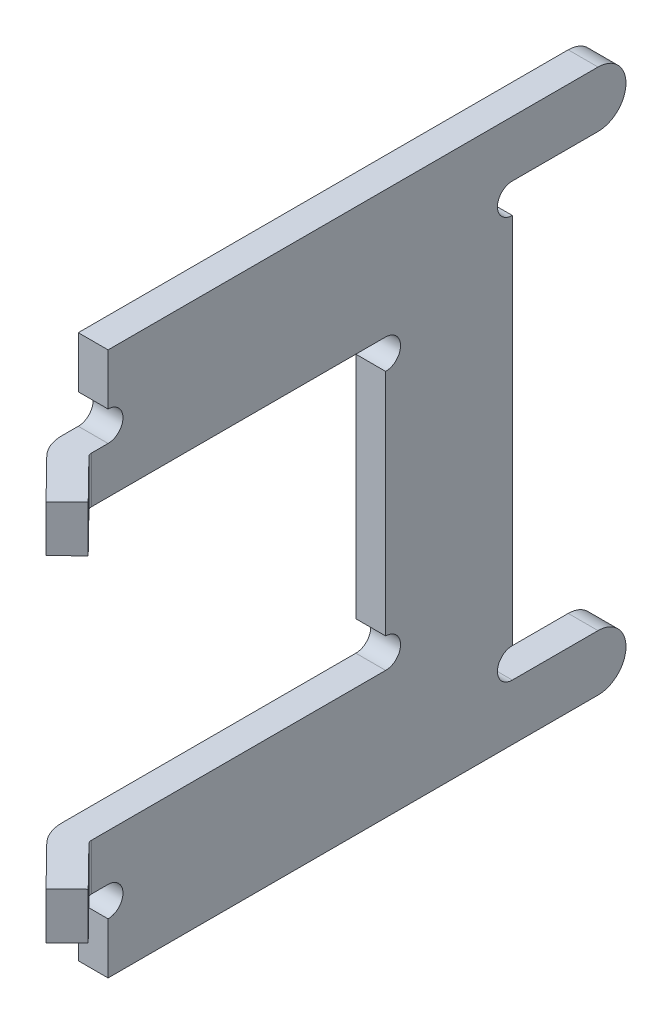
ISO-10303-21;
HEADER;
FILE_DESCRIPTION(('STEP AP214'),'2;1');
FILE_NAME('part.step','',(''),(''),'','','');
FILE_SCHEMA(('AUTOMOTIVE_DESIGN { 1 0 10303 214 1 1 1 1 }'));
ENDSEC;
DATA;
#1=APPLICATION_CONTEXT('core data for automotive mechanical design processes');
#2=APPLICATION_PROTOCOL_DEFINITION('international standard','automotive_design',2000,#1);
#3=PRODUCT_CONTEXT('',#1,'mechanical');
#4=PRODUCT('Part','Part','',(#3));
#5=PRODUCT_RELATED_PRODUCT_CATEGORY('part','',(#4));
#6=PRODUCT_DEFINITION_FORMATION('','',#4);
#7=PRODUCT_DEFINITION_CONTEXT('part definition',#1,'design');
#8=PRODUCT_DEFINITION('design','',#6,#7);
#9=PRODUCT_DEFINITION_SHAPE('','',#8);
#10=(LENGTH_UNIT() NAMED_UNIT(*) SI_UNIT(.MILLI.,.METRE.));
#11=(NAMED_UNIT(*) PLANE_ANGLE_UNIT() SI_UNIT($,.RADIAN.));
#12=(NAMED_UNIT(*) SI_UNIT($,.STERADIAN.) SOLID_ANGLE_UNIT());
#13=UNCERTAINTY_MEASURE_WITH_UNIT(LENGTH_MEASURE(1.E-05),#10,'distance_accuracy_value','');
#14=(GEOMETRIC_REPRESENTATION_CONTEXT(3) GLOBAL_UNCERTAINTY_ASSIGNED_CONTEXT((#13)) GLOBAL_UNIT_ASSIGNED_CONTEXT((#10,
#11,#12)) REPRESENTATION_CONTEXT('',''));
#15=CARTESIAN_POINT('',(0.,0.,0.));
#16=DIRECTION('',(0.,0.,1.));
#17=DIRECTION('',(1.,0.,0.));
#18=AXIS2_PLACEMENT_3D('',#15,#16,#17);
#19=CARTESIAN_POINT('',(0.,5.125,7.125));
#20=DIRECTION('',(0.,1.,0.));
#21=DIRECTION('',(0.,0.,1.));
#22=AXIS2_PLACEMENT_3D('',#19,#20,#21);
#23=PLANE('',#22);
#24=CARTESIAN_POINT('',(0.555393539521985,5.125,11.3));
#25=DIRECTION('',(0.,1.,0.));
#26=DIRECTION('',(0.,0.,1.));
#27=AXIS2_PLACEMENT_3D('',#24,#25,#26);
#28=CIRCLE('',#27,0.155393539521985);
#29=CARTESIAN_POINT('',(0.444517707938763,5.125,11.4088747082471));
#30=VERTEX_POINT('',#29);
#31=CARTESIAN_POINT('',(0.4,5.125,11.3));
#32=VERTEX_POINT('',#31);
#33=EDGE_CURVE('E20',#30,#32,#28,.F.);
#34=ORIENTED_EDGE('',*,*,#33,.T.);
#35=DIRECTION('',(0.,0.,1.));
#36=VECTOR('',#35,1.);
#37=CARTESIAN_POINT('',(0.4,5.125,7.125));
#38=LINE('',#37,#36);
#39=CARTESIAN_POINT('',(0.399999999999999,5.125,10.85));
#40=VERTEX_POINT('',#39);
#41=EDGE_CURVE('E200',#32,#40,#38,.F.);
#42=ORIENTED_EDGE('',*,*,#41,.T.);
#43=DIRECTION('',(-1.,0.,0.));
#44=VECTOR('',#43,1.);
#45=CARTESIAN_POINT('',(0.4,5.125,10.85));
#46=LINE('',#45,#44);
#47=CARTESIAN_POINT('',(-0.400000000000001,5.125,10.85));
#48=VERTEX_POINT('',#47);
#49=EDGE_CURVE('E230',#40,#48,#46,.T.);
#50=ORIENTED_EDGE('',*,*,#49,.T.);
#51=DIRECTION('',(0.,0.,1.));
#52=VECTOR('',#51,1.);
#53=CARTESIAN_POINT('',(-0.399999999999999,5.125,0.));
#54=LINE('',#53,#52);
#55=CARTESIAN_POINT('',(-0.399999999999999,5.125,11.3));
#56=VERTEX_POINT('',#55);
#57=EDGE_CURVE('E261',#56,#48,#54,.F.);
#58=ORIENTED_EDGE('',*,*,#57,.F.);
#59=CARTESIAN_POINT('',(0.555393539521985,5.125,11.3));
#60=DIRECTION('',(0.,1.,0.));
#61=DIRECTION('',(0.,0.,1.));
#62=AXIS2_PLACEMENT_3D('',#59,#60,#61);
#63=CIRCLE('',#62,0.955393539521986);
#64=CARTESIAN_POINT('',(-0.126295374377499,5.125,11.969385569031));
#65=VERTEX_POINT('',#64);
#66=EDGE_CURVE('E268',#65,#56,#63,.F.);
#67=ORIENTED_EDGE('',*,*,#66,.F.);
#68=DIRECTION('',(0.700638575979764,0.,0.713516352895326));
#69=VECTOR('',#68,1.);
#70=CARTESIAN_POINT('',(0.924662489592148,5.125,13.0396600983739));
#71=LINE('',#70,#69);
#72=CARTESIAN_POINT('',(0.924662489592147,5.125,13.0396600983739));
#73=VERTEX_POINT('',#72);
#74=EDGE_CURVE('E257',#73,#65,#71,.F.);
#75=ORIENTED_EDGE('',*,*,#74,.F.);
#76=DIRECTION('',(0.713516352895326,0.,-0.700638575979765));
#77=VECTOR('',#76,1.);
#78=CARTESIAN_POINT('',(1.49547557190841,5.125,12.4791492375901));
#79=LINE('',#78,#77);
#80=CARTESIAN_POINT('',(1.49547557190841,5.125,12.4791492375901));
#81=VERTEX_POINT('',#80);
#82=EDGE_CURVE('E206',#81,#73,#79,.F.);
#83=ORIENTED_EDGE('',*,*,#82,.F.);
#84=DIRECTION('',(-0.700638575979764,0.,-0.713516352895326));
#85=VECTOR('',#84,1.);
#86=CARTESIAN_POINT('',(0.444517707938763,5.125,11.4088747082471));
#87=LINE('',#86,#85);
#88=EDGE_CURVE('E203',#30,#81,#87,.F.);
#89=ORIENTED_EDGE('',*,*,#88,.F.);
#90=EDGE_LOOP('',(#34,#42,#50,#58,#67,#75,#83,#89));
#91=FACE_BOUND('',#90,.T.);
#92=ADVANCED_FACE('F17',(#91),#23,.T.);
#93=CARTESIAN_POINT('',(0.555393539521985,3.875,11.3));
#94=DIRECTION('',(0.,1.,0.));
#95=DIRECTION('',(0.,0.,1.));
#96=AXIS2_PLACEMENT_3D('',#93,#94,#95);
#97=CYLINDRICAL_SURFACE('',#96,0.955393539521986);
#98=CARTESIAN_POINT('',(0.555393539521985,3.875,11.3));
#99=DIRECTION('',(0.,1.,0.));
#100=DIRECTION('',(0.,0.,1.));
#101=AXIS2_PLACEMENT_3D('',#98,#99,#100);
#102=CIRCLE('',#101,0.955393539521986);
#103=CARTESIAN_POINT('',(-0.400000000000001,3.875,11.3));
#104=VERTEX_POINT('',#103);
#105=CARTESIAN_POINT('',(-0.126295374377499,3.875,11.969385569031));
#106=VERTEX_POINT('',#105);
#107=EDGE_CURVE('E226',#104,#106,#102,.T.);
#108=ORIENTED_EDGE('',*,*,#107,.T.);
#109=DIRECTION('',(0.,1.,0.));
#110=VECTOR('',#109,1.);
#111=CARTESIAN_POINT('',(-0.1262953743775,3.875,11.969385569031));
#112=LINE('',#111,#110);
#113=EDGE_CURVE('E253',#65,#106,#112,.F.);
#114=ORIENTED_EDGE('',*,*,#113,.F.);
#115=ORIENTED_EDGE('',*,*,#66,.T.);
#116=DIRECTION('',(0.,1.,0.));
#117=VECTOR('',#116,1.);
#118=CARTESIAN_POINT('',(-0.399999999999999,-7.3,11.3));
#119=LINE('',#118,#117);
#120=EDGE_CURVE('E258',#104,#56,#119,.T.);
#121=ORIENTED_EDGE('',*,*,#120,.F.);
#122=EDGE_LOOP('',(#108,#114,#115,#121));
#123=FACE_BOUND('',#122,.T.);
#124=ADVANCED_FACE('F406',(#123),#97,.T.);
#125=CARTESIAN_POINT('',(0.924662489592148,3.875,13.0396600983739));
#126=DIRECTION('',(-0.713516352895326,0.,0.700638575979764));
#127=DIRECTION('',(0.700638575979764,0.,0.713516352895326));
#128=AXIS2_PLACEMENT_3D('',#125,#126,#127);
#129=PLANE('',#128);
#130=DIRECTION('',(0.700638575979764,0.,0.713516352895326));
#131=VECTOR('',#130,1.);
#132=CARTESIAN_POINT('',(-0.1262953743775,3.875,11.969385569031));
#133=LINE('',#132,#131);
#134=CARTESIAN_POINT('',(0.924662489592148,3.875,13.0396600983739));
#135=VERTEX_POINT('',#134);
#136=EDGE_CURVE('E245',#106,#135,#133,.T.);
#137=ORIENTED_EDGE('',*,*,#136,.T.);
#138=DIRECTION('',(0.,1.,0.));
#139=VECTOR('',#138,1.);
#140=CARTESIAN_POINT('',(0.924662489592147,3.875,13.0396600983739));
#141=LINE('',#140,#139);
#142=EDGE_CURVE('E212',#73,#135,#141,.F.);
#143=ORIENTED_EDGE('',*,*,#142,.F.);
#144=ORIENTED_EDGE('',*,*,#74,.T.);
#145=ORIENTED_EDGE('',*,*,#113,.T.);
#146=EDGE_LOOP('',(#137,#143,#144,#145));
#147=FACE_BOUND('',#146,.T.);
#148=ADVANCED_FACE('F425',(#147),#129,.T.);
#149=CARTESIAN_POINT('',(1.49547557190841,3.875,12.4791492375901));
#150=DIRECTION('',(0.700638575979765,0.,0.713516352895326));
#151=DIRECTION('',(0.713516352895326,0.,-0.700638575979765));
#152=AXIS2_PLACEMENT_3D('',#149,#150,#151);
#153=PLANE('',#152);
#154=DIRECTION('',(0.713516352895325,0.,-0.700638575979766));
#155=VECTOR('',#154,1.);
#156=CARTESIAN_POINT('',(0.924662489592148,3.875,13.0396600983739));
#157=LINE('',#156,#155);
#158=CARTESIAN_POINT('',(1.49547557190841,3.875,12.4791492375901));
#159=VERTEX_POINT('',#158);
#160=EDGE_CURVE('E241',#135,#159,#157,.T.);
#161=ORIENTED_EDGE('',*,*,#160,.T.);
#162=DIRECTION('',(0.,1.,0.));
#163=VECTOR('',#162,1.);
#164=CARTESIAN_POINT('',(1.49547557190841,3.875,12.4791492375901));
#165=LINE('',#164,#163);
#166=EDGE_CURVE('E211',#81,#159,#165,.F.);
#167=ORIENTED_EDGE('',*,*,#166,.F.);
#168=ORIENTED_EDGE('',*,*,#82,.T.);
#169=ORIENTED_EDGE('',*,*,#142,.T.);
#170=EDGE_LOOP('',(#161,#167,#168,#169));
#171=FACE_BOUND('',#170,.T.);
#172=ADVANCED_FACE('F940',(#171),#153,.T.);
#173=CARTESIAN_POINT('',(0.444517707938763,3.875,11.4088747082471));
#174=DIRECTION('',(0.713516352895326,0.,-0.700638575979764));
#175=DIRECTION('',(-0.700638575979764,0.,-0.713516352895326));
#176=AXIS2_PLACEMENT_3D('',#173,#174,#175);
#177=PLANE('',#176);
#178=DIRECTION('',(-0.700638575979764,0.,-0.713516352895326));
#179=VECTOR('',#178,1.);
#180=CARTESIAN_POINT('',(1.49547557190841,3.875,12.4791492375901));
#181=LINE('',#180,#179);
#182=CARTESIAN_POINT('',(0.444517707938763,3.875,11.4088747082471));
#183=VERTEX_POINT('',#182);
#184=EDGE_CURVE('E216',#159,#183,#181,.T.);
#185=ORIENTED_EDGE('',*,*,#184,.T.);
#186=DIRECTION('',(0.,1.,0.));
#187=VECTOR('',#186,1.);
#188=CARTESIAN_POINT('',(0.444517707938762,3.875,11.4088747082471));
#189=LINE('',#188,#187);
#190=EDGE_CURVE('E194',#183,#30,#189,.T.);
#191=ORIENTED_EDGE('',*,*,#190,.T.);
#192=ORIENTED_EDGE('',*,*,#88,.T.);
#193=ORIENTED_EDGE('',*,*,#166,.T.);
#194=EDGE_LOOP('',(#185,#191,#192,#193));
#195=FACE_BOUND('',#194,.T.);
#196=ADVANCED_FACE('F214',(#195),#177,.T.);
#197=CARTESIAN_POINT('',(1.49547557190841,-3.875,12.4791492375901));
#198=DIRECTION('',(-0.700638575979765,0.,-0.713516352895326));
#199=DIRECTION('',(-0.713516352895326,0.,0.700638575979765));
#200=AXIS2_PLACEMENT_3D('',#197,#198,#199);
#201=PLANE('',#200);
#202=DIRECTION('',(0.,1.,0.));
#203=VECTOR('',#202,1.);
#204=CARTESIAN_POINT('',(1.49547557190841,-3.875,12.4791492375901));
#205=LINE('',#204,#203);
#206=CARTESIAN_POINT('',(1.49547557190841,-5.125,12.4791492375901));
#207=VERTEX_POINT('',#206);
#208=CARTESIAN_POINT('',(1.49547557190841,-3.875,12.4791492375901));
#209=VERTEX_POINT('',#208);
#210=EDGE_CURVE('E399',#207,#209,#205,.T.);
#211=ORIENTED_EDGE('',*,*,#210,.T.);
#212=DIRECTION('',(-0.713516352895325,0.,0.700638575979766));
#213=VECTOR('',#212,1.);
#214=CARTESIAN_POINT('',(1.49547557190841,-3.875,12.4791492375901));
#215=LINE('',#214,#213);
#216=CARTESIAN_POINT('',(0.924662489592148,-3.875,13.0396600983739));
#217=VERTEX_POINT('',#216);
#218=EDGE_CURVE('E519',#209,#217,#215,.T.);
#219=ORIENTED_EDGE('',*,*,#218,.T.);
#220=DIRECTION('',(0.,1.,0.));
#221=VECTOR('',#220,1.);
#222=CARTESIAN_POINT('',(0.924662489592148,-3.875,13.0396600983739));
#223=LINE('',#222,#221);
#224=CARTESIAN_POINT('',(0.924662489592148,-5.125,13.0396600983739));
#225=VERTEX_POINT('',#224);
#226=EDGE_CURVE('E238',#217,#225,#223,.F.);
#227=ORIENTED_EDGE('',*,*,#226,.T.);
#228=DIRECTION('',(0.713516352895325,0.,-0.700638575979766));
#229=VECTOR('',#228,1.);
#230=CARTESIAN_POINT('',(0.924662489592148,-5.125,13.0396600983739));
#231=LINE('',#230,#229);
#232=EDGE_CURVE('E288',#225,#207,#231,.T.);
#233=ORIENTED_EDGE('',*,*,#232,.T.);
#234=EDGE_LOOP('',(#211,#219,#227,#233));
#235=FACE_BOUND('',#234,.T.);
#236=ADVANCED_FACE('F616',(#235),#201,.F.);
#237=CARTESIAN_POINT('',(0.924662489592148,-3.875,13.0396600983739));
#238=DIRECTION('',(0.713516352895326,0.,-0.700638575979764));
#239=DIRECTION('',(-0.700638575979764,0.,-0.713516352895326));
#240=AXIS2_PLACEMENT_3D('',#237,#238,#239);
#241=PLANE('',#240);
#242=ORIENTED_EDGE('',*,*,#226,.F.);
#243=DIRECTION('',(-0.700638575979764,0.,-0.713516352895326));
#244=VECTOR('',#243,1.);
#245=CARTESIAN_POINT('',(0.924662489592148,-3.875,13.0396600983739));
#246=LINE('',#245,#244);
#247=CARTESIAN_POINT('',(-0.1262953743775,-3.875,11.969385569031));
#248=VERTEX_POINT('',#247);
#249=EDGE_CURVE('E375',#217,#248,#246,.T.);
#250=ORIENTED_EDGE('',*,*,#249,.T.);
#251=DIRECTION('',(0.,1.,0.));
#252=VECTOR('',#251,1.);
#253=CARTESIAN_POINT('',(-0.126295374377501,-3.875,11.969385569031));
#254=LINE('',#253,#252);
#255=CARTESIAN_POINT('',(-0.1262953743775,-5.125,11.969385569031));
#256=VERTEX_POINT('',#255);
#257=EDGE_CURVE('E600',#256,#248,#254,.T.);
#258=ORIENTED_EDGE('',*,*,#257,.F.);
#259=DIRECTION('',(0.700638575979764,0.,0.713516352895326));
#260=VECTOR('',#259,1.);
#261=CARTESIAN_POINT('',(-0.1262953743775,-5.125,11.969385569031));
#262=LINE('',#261,#260);
#263=EDGE_CURVE('E293',#256,#225,#262,.T.);
#264=ORIENTED_EDGE('',*,*,#263,.T.);
#265=EDGE_LOOP('',(#242,#250,#258,#264));
#266=FACE_BOUND('',#265,.T.);
#267=ADVANCED_FACE('F633',(#266),#241,.F.);
#268=CARTESIAN_POINT('',(0.555393539521985,-3.875,11.3));
#269=DIRECTION('',(0.,1.,0.));
#270=DIRECTION('',(0.,0.,1.));
#271=AXIS2_PLACEMENT_3D('',#268,#269,#270);
#272=CYLINDRICAL_SURFACE('',#271,0.955393539521986);
#273=CARTESIAN_POINT('',(0.555393539521985,-3.875,11.3));
#274=DIRECTION('',(0.,1.,0.));
#275=DIRECTION('',(0.,0.,1.));
#276=AXIS2_PLACEMENT_3D('',#273,#274,#275);
#277=CIRCLE('',#276,0.955393539521986);
#278=CARTESIAN_POINT('',(-0.4,-3.875,11.3));
#279=VERTEX_POINT('',#278);
#280=EDGE_CURVE('E371',#248,#279,#277,.F.);
#281=ORIENTED_EDGE('',*,*,#280,.T.);
#282=DIRECTION('',(0.,1.,0.));
#283=VECTOR('',#282,1.);
#284=CARTESIAN_POINT('',(-0.399999999999999,-7.3,11.3));
#285=LINE('',#284,#283);
#286=CARTESIAN_POINT('',(-0.399999999999999,-5.125,11.3));
#287=VERTEX_POINT('',#286);
#288=EDGE_CURVE('E262',#287,#279,#285,.T.);
#289=ORIENTED_EDGE('',*,*,#288,.F.);
#290=CARTESIAN_POINT('',(0.555393539521985,-5.125,11.3));
#291=DIRECTION('',(0.,1.,0.));
#292=DIRECTION('',(0.,0.,1.));
#293=AXIS2_PLACEMENT_3D('',#290,#291,#292);
#294=CIRCLE('',#293,0.955393539521986);
#295=EDGE_CURVE('E396',#287,#256,#294,.T.);
#296=ORIENTED_EDGE('',*,*,#295,.T.);
#297=ORIENTED_EDGE('',*,*,#257,.T.);
#298=EDGE_LOOP('',(#281,#289,#296,#297));
#299=FACE_BOUND('',#298,.T.);
#300=ADVANCED_FACE('F635',(#299),#272,.T.);
#301=CARTESIAN_POINT('',(0.444517707938763,-3.875,11.4088747082471));
#302=DIRECTION('',(-0.713516352895326,0.,0.700638575979764));
#303=DIRECTION('',(0.700638575979764,0.,0.713516352895326));
#304=AXIS2_PLACEMENT_3D('',#301,#302,#303);
#305=PLANE('',#304);
#306=DIRECTION('',(0.,1.,0.));
#307=VECTOR('',#306,1.);
#308=CARTESIAN_POINT('',(0.444517707938762,-3.875,11.4088747082471));
#309=LINE('',#308,#307);
#310=CARTESIAN_POINT('',(0.444517707938763,-5.125,11.4088747082471));
#311=VERTEX_POINT('',#310);
#312=CARTESIAN_POINT('',(0.444517707938763,-3.875,11.4088747082471));
#313=VERTEX_POINT('',#312);
#314=EDGE_CURVE('E370',#311,#313,#309,.T.);
#315=ORIENTED_EDGE('',*,*,#314,.T.);
#316=DIRECTION('',(0.700638575979764,0.,0.713516352895326));
#317=VECTOR('',#316,1.);
#318=CARTESIAN_POINT('',(0.444517707938763,-3.875,11.4088747082471));
#319=LINE('',#318,#317);
#320=EDGE_CURVE('E522',#313,#209,#319,.T.);
#321=ORIENTED_EDGE('',*,*,#320,.T.);
#322=ORIENTED_EDGE('',*,*,#210,.F.);
#323=DIRECTION('',(-0.700638575979764,0.,-0.713516352895326));
#324=VECTOR('',#323,1.);
#325=CARTESIAN_POINT('',(1.49547557190841,-5.125,12.4791492375901));
#326=LINE('',#325,#324);
#327=EDGE_CURVE('E292',#207,#311,#326,.T.);
#328=ORIENTED_EDGE('',*,*,#327,.T.);
#329=EDGE_LOOP('',(#315,#321,#322,#328));
#330=FACE_BOUND('',#329,.T.);
#331=ADVANCED_FACE('F623',(#330),#305,.F.);
#332=CARTESIAN_POINT('',(0.,-5.125,7.125));
#333=DIRECTION('',(0.,1.,0.));
#334=DIRECTION('',(0.,0.,1.));
#335=AXIS2_PLACEMENT_3D('',#332,#333,#334);
#336=PLANE('',#335);
#337=DIRECTION('',(0.,0.,1.));
#338=VECTOR('',#337,1.);
#339=CARTESIAN_POINT('',(0.4,-5.125,7.125));
#340=LINE('',#339,#338);
#341=CARTESIAN_POINT('',(0.4,-5.125,11.3));
#342=VERTEX_POINT('',#341);
#343=CARTESIAN_POINT('',(0.399999999999999,-5.125,10.85));
#344=VERTEX_POINT('',#343);
#345=EDGE_CURVE('E572',#342,#344,#340,.F.);
#346=ORIENTED_EDGE('',*,*,#345,.F.);
#347=CARTESIAN_POINT('',(0.555393539521985,-5.125,11.3));
#348=DIRECTION('',(0.,1.,0.));
#349=DIRECTION('',(0.,0.,1.));
#350=AXIS2_PLACEMENT_3D('',#347,#348,#349);
#351=CIRCLE('',#350,0.155393539521985);
#352=EDGE_CURVE('E363',#342,#311,#351,.T.);
#353=ORIENTED_EDGE('',*,*,#352,.T.);
#354=ORIENTED_EDGE('',*,*,#327,.F.);
#355=ORIENTED_EDGE('',*,*,#232,.F.);
#356=ORIENTED_EDGE('',*,*,#263,.F.);
#357=ORIENTED_EDGE('',*,*,#295,.F.);
#358=DIRECTION('',(0.,0.,1.));
#359=VECTOR('',#358,1.);
#360=CARTESIAN_POINT('',(-0.399999999999999,-5.125,0.));
#361=LINE('',#360,#359);
#362=CARTESIAN_POINT('',(-0.399999999999999,-5.125,10.85));
#363=VERTEX_POINT('',#362);
#364=EDGE_CURVE('E568',#363,#287,#361,.T.);
#365=ORIENTED_EDGE('',*,*,#364,.F.);
#366=DIRECTION('',(-1.,0.,0.));
#367=VECTOR('',#366,1.);
#368=CARTESIAN_POINT('',(0.400000000000001,-5.125,10.85));
#369=LINE('',#368,#367);
#370=EDGE_CURVE('E362',#363,#344,#369,.F.);
#371=ORIENTED_EDGE('',*,*,#370,.T.);
#372=EDGE_LOOP('',(#346,#353,#354,#355,#356,#357,#365,#371));
#373=FACE_BOUND('',#372,.T.);
#374=ADVANCED_FACE('F639',(#373),#336,.F.);
#375=CARTESIAN_POINT('',(-0.399999999999999,-7.3,0.));
#376=DIRECTION('',(-1.,0.,0.));
#377=DIRECTION('',(0.,0.,1.));
#378=AXIS2_PLACEMENT_3D('',#375,#376,#377);
#379=PLANE('',#378);
#380=CARTESIAN_POINT('',(-0.400000000000004,6.54999999999999,-2.29999999999991));
#381=DIRECTION('',(1.,0.,0.));
#382=DIRECTION('',(0.,0.,-1.));
#383=AXIS2_PLACEMENT_3D('',#380,#381,#382);
#384=CIRCLE('',#383,0.750000000000002);
#385=CARTESIAN_POINT('',(-0.400000000000004,5.79999999999999,-2.29999999999991));
#386=VERTEX_POINT('',#385);
#387=CARTESIAN_POINT('',(-0.400000000000004,7.3,-2.29999999999991));
#388=VERTEX_POINT('',#387);
#389=EDGE_CURVE('E390',#386,#388,#384,.T.);
#390=ORIENTED_EDGE('',*,*,#389,.F.);
#391=DIRECTION('',(0.,0.,-1.));
#392=VECTOR('',#391,1.);
#393=CARTESIAN_POINT('',(-0.400000000000004,5.79999999999999,-2.29999999999991));
#394=LINE('',#393,#392);
#395=CARTESIAN_POINT('',(-0.400000000000004,5.79999999999999,0.));
#396=VERTEX_POINT('',#395);
#397=EDGE_CURVE('E283',#396,#386,#394,.T.);
#398=ORIENTED_EDGE('',*,*,#397,.F.);
#399=CARTESIAN_POINT('',(-0.400000000000004,5.4,0.));
#400=DIRECTION('',(1.,0.,0.));
#401=DIRECTION('',(0.,0.,-1.));
#402=AXIS2_PLACEMENT_3D('',#399,#400,#401);
#403=CIRCLE('',#402,0.4);
#404=CARTESIAN_POINT('',(-0.400000000000004,5.,0.));
#405=VERTEX_POINT('',#404);
#406=EDGE_CURVE('E393',#396,#405,#403,.T.);
#407=ORIENTED_EDGE('',*,*,#406,.T.);
#408=DIRECTION('',(0.,1.,0.));
#409=VECTOR('',#408,1.);
#410=CARTESIAN_POINT('',(-0.400000000000003,0.,0.));
#411=LINE('',#410,#409);
#412=CARTESIAN_POINT('',(-0.400000000000002,-5.,0.));
#413=VERTEX_POINT('',#412);
#414=EDGE_CURVE('E497',#405,#413,#411,.F.);
#415=ORIENTED_EDGE('',*,*,#414,.T.);
#416=CARTESIAN_POINT('',(-0.4,-5.4,0.));
#417=DIRECTION('',(1.,0.,0.));
#418=DIRECTION('',(0.,0.,-1.));
#419=AXIS2_PLACEMENT_3D('',#416,#417,#418);
#420=CIRCLE('',#419,0.4);
#421=CARTESIAN_POINT('',(-0.4,-5.8,0.));
#422=VERTEX_POINT('',#421);
#423=EDGE_CURVE('E347',#413,#422,#420,.T.);
#424=ORIENTED_EDGE('',*,*,#423,.T.);
#425=DIRECTION('',(0.,0.,1.));
#426=VECTOR('',#425,1.);
#427=CARTESIAN_POINT('',(-0.4,-5.8,0.));
#428=LINE('',#427,#426);
#429=CARTESIAN_POINT('',(-0.4,-5.8,-2.3));
#430=VERTEX_POINT('',#429);
#431=EDGE_CURVE('E351',#430,#422,#428,.T.);
#432=ORIENTED_EDGE('',*,*,#431,.F.);
#433=CARTESIAN_POINT('',(-0.399999999999999,-6.55,-2.3));
#434=DIRECTION('',(1.,0.,0.));
#435=DIRECTION('',(0.,0.,-1.));
#436=AXIS2_PLACEMENT_3D('',#433,#434,#435);
#437=CIRCLE('',#436,0.75);
#438=CARTESIAN_POINT('',(-0.399999999999999,-7.3,-2.3));
#439=VERTEX_POINT('',#438);
#440=EDGE_CURVE('E352',#439,#430,#437,.T.);
#441=ORIENTED_EDGE('',*,*,#440,.F.);
#442=DIRECTION('',(0.,0.,-1.));
#443=VECTOR('',#442,1.);
#444=CARTESIAN_POINT('',(-0.399999999999999,-7.3,0.));
#445=LINE('',#444,#443);
#446=CARTESIAN_POINT('',(-0.399999999999999,-7.3,10.85));
#447=VERTEX_POINT('',#446);
#448=EDGE_CURVE('E457',#447,#439,#445,.T.);
#449=ORIENTED_EDGE('',*,*,#448,.F.);
#450=DIRECTION('',(0.,1.,0.));
#451=VECTOR('',#450,1.);
#452=CARTESIAN_POINT('',(-0.399999999999999,0.,10.85));
#453=LINE('',#452,#451);
#454=CARTESIAN_POINT('',(-0.399999999999999,-5.925,10.85));
#455=VERTEX_POINT('',#454);
#456=EDGE_CURVE('E454',#455,#447,#453,.F.);
#457=ORIENTED_EDGE('',*,*,#456,.F.);
#458=CARTESIAN_POINT('',(-0.399999999999999,-5.525,10.85));
#459=DIRECTION('',(-1.,0.,0.));
#460=DIRECTION('',(0.,0.,1.));
#461=AXIS2_PLACEMENT_3D('',#458,#459,#460);
#462=CIRCLE('',#461,0.4);
#463=EDGE_CURVE('E357',#455,#363,#462,.F.);
#464=ORIENTED_EDGE('',*,*,#463,.T.);
#465=ORIENTED_EDGE('',*,*,#364,.T.);
#466=ORIENTED_EDGE('',*,*,#288,.T.);
#467=DIRECTION('',(0.,0.,-1.));
#468=VECTOR('',#467,1.);
#469=CARTESIAN_POINT('',(-0.400000000000001,-3.875,3.4));
#470=LINE('',#469,#468);
#471=CARTESIAN_POINT('',(-0.400000000000001,-3.875,3.4));
#472=VERTEX_POINT('',#471);
#473=EDGE_CURVE('E374',#279,#472,#470,.T.);
#474=ORIENTED_EDGE('',*,*,#473,.T.);
#475=CARTESIAN_POINT('',(-0.4,-3.475,3.4));
#476=DIRECTION('',(1.,0.,0.));
#477=DIRECTION('',(0.,0.,-1.));
#478=AXIS2_PLACEMENT_3D('',#475,#476,#477);
#479=CIRCLE('',#478,0.4);
#480=CARTESIAN_POINT('',(-0.4,-3.075,3.4));
#481=VERTEX_POINT('',#480);
#482=EDGE_CURVE('E376',#472,#481,#479,.T.);
#483=ORIENTED_EDGE('',*,*,#482,.T.);
#484=DIRECTION('',(0.,1.,0.));
#485=VECTOR('',#484,1.);
#486=CARTESIAN_POINT('',(-0.400000000000001,3.075,3.4));
#487=LINE('',#486,#485);
#488=CARTESIAN_POINT('',(-0.400000000000002,3.075,3.4));
#489=VERTEX_POINT('',#488);
#490=EDGE_CURVE('E234',#481,#489,#487,.T.);
#491=ORIENTED_EDGE('',*,*,#490,.T.);
#492=CARTESIAN_POINT('',(-0.400000000000003,3.475,3.4));
#493=DIRECTION('',(1.,0.,0.));
#494=DIRECTION('',(0.,0.,-1.));
#495=AXIS2_PLACEMENT_3D('',#492,#493,#494);
#496=CIRCLE('',#495,0.4);
#497=CARTESIAN_POINT('',(-0.400000000000003,3.875,3.4));
#498=VERTEX_POINT('',#497);
#499=EDGE_CURVE('E381',#489,#498,#496,.T.);
#500=ORIENTED_EDGE('',*,*,#499,.T.);
#501=DIRECTION('',(0.,0.,1.));
#502=VECTOR('',#501,1.);
#503=CARTESIAN_POINT('',(-0.400000000000003,3.875,10.85));
#504=LINE('',#503,#502);
#505=EDGE_CURVE('E218',#498,#104,#504,.T.);
#506=ORIENTED_EDGE('',*,*,#505,.T.);
#507=ORIENTED_EDGE('',*,*,#120,.T.);
#508=ORIENTED_EDGE('',*,*,#57,.T.);
#509=CARTESIAN_POINT('',(-0.400000000000003,5.525,10.85));
#510=DIRECTION('',(-1.,0.,0.));
#511=DIRECTION('',(0.,0.,1.));
#512=AXIS2_PLACEMENT_3D('',#509,#510,#511);
#513=CIRCLE('',#512,0.4);
#514=CARTESIAN_POINT('',(-0.400000000000004,5.925,10.85));
#515=VERTEX_POINT('',#514);
#516=EDGE_CURVE('E219',#48,#515,#513,.F.);
#517=ORIENTED_EDGE('',*,*,#516,.T.);
#518=DIRECTION('',(0.,1.,0.));
#519=VECTOR('',#518,1.);
#520=CARTESIAN_POINT('',(-0.400000000000004,0.,10.85));
#521=LINE('',#520,#519);
#522=CARTESIAN_POINT('',(-0.400000000000004,7.3,10.85));
#523=VERTEX_POINT('',#522);
#524=EDGE_CURVE('E269',#523,#515,#521,.F.);
#525=ORIENTED_EDGE('',*,*,#524,.F.);
#526=DIRECTION('',(0.,0.,1.));
#527=VECTOR('',#526,1.);
#528=CARTESIAN_POINT('',(-0.400000000000004,7.3,0.));
#529=LINE('',#528,#527);
#530=EDGE_CURVE('E276',#388,#523,#529,.T.);
#531=ORIENTED_EDGE('',*,*,#530,.F.);
#532=EDGE_LOOP('',(#390,#398,#407,#415,#424,#432,#441,#449,#457,#464,#465,#466,#474,#483,#491,
#500,#506,#507,#508,#517,#525,#531));
#533=FACE_BOUND('',#532,.T.);
#534=ADVANCED_FACE('F414',(#533),#379,.T.);
#535=CARTESIAN_POINT('',(-0.400000000000004,5.4,0.));
#536=DIRECTION('',(1.,0.,0.));
#537=DIRECTION('',(0.,0.,-1.));
#538=AXIS2_PLACEMENT_3D('',#535,#536,#537);
#539=CYLINDRICAL_SURFACE('',#538,0.4);
#540=DIRECTION('',(1.,0.,0.));
#541=VECTOR('',#540,1.);
#542=CARTESIAN_POINT('',(0.,5.,0.));
#543=LINE('',#542,#541);
#544=CARTESIAN_POINT('',(0.399999999999998,5.,0.));
#545=VERTEX_POINT('',#544);
#546=EDGE_CURVE('E346',#545,#405,#543,.F.);
#547=ORIENTED_EDGE('',*,*,#546,.T.);
#548=ORIENTED_EDGE('',*,*,#406,.F.);
#549=DIRECTION('',(1.,0.,0.));
#550=VECTOR('',#549,1.);
#551=CARTESIAN_POINT('',(-0.400000000000004,5.79999999999999,0.));
#552=LINE('',#551,#550);
#553=CARTESIAN_POINT('',(0.399999999999997,5.79999999999999,0.));
#554=VERTEX_POINT('',#553);
#555=EDGE_CURVE('E287',#554,#396,#552,.F.);
#556=ORIENTED_EDGE('',*,*,#555,.F.);
#557=CARTESIAN_POINT('',(0.399999999999997,5.4,0.));
#558=DIRECTION('',(1.,0.,0.));
#559=DIRECTION('',(0.,0.,-1.));
#560=AXIS2_PLACEMENT_3D('',#557,#558,#559);
#561=CIRCLE('',#560,0.4);
#562=EDGE_CURVE('E342',#545,#554,#561,.F.);
#563=ORIENTED_EDGE('',*,*,#562,.F.);
#564=EDGE_LOOP('',(#547,#548,#556,#563));
#565=FACE_BOUND('',#564,.T.);
#566=ADVANCED_FACE('F683',(#565),#539,.F.);
#567=CARTESIAN_POINT('',(-0.400000000000004,5.79999999999999,-2.29999999999991));
#568=DIRECTION('',(0.,-1.,0.));
#569=DIRECTION('',(0.,0.,-1.));
#570=AXIS2_PLACEMENT_3D('',#567,#568,#569);
#571=PLANE('',#570);
#572=ORIENTED_EDGE('',*,*,#397,.T.);
#573=DIRECTION('',(1.,0.,0.));
#574=VECTOR('',#573,1.);
#575=CARTESIAN_POINT('',(-0.400000000000004,5.79999999999999,-2.29999999999991));
#576=LINE('',#575,#574);
#577=CARTESIAN_POINT('',(0.399999999999996,5.79999999999999,-2.29999999999991));
#578=VERTEX_POINT('',#577);
#579=EDGE_CURVE('E286',#578,#386,#576,.F.);
#580=ORIENTED_EDGE('',*,*,#579,.F.);
#581=DIRECTION('',(0.,0.,-1.));
#582=VECTOR('',#581,1.);
#583=CARTESIAN_POINT('',(0.399999999999999,5.8,0.));
#584=LINE('',#583,#582);
#585=EDGE_CURVE('E341',#554,#578,#584,.T.);
#586=ORIENTED_EDGE('',*,*,#585,.F.);
#587=ORIENTED_EDGE('',*,*,#555,.T.);
#588=EDGE_LOOP('',(#572,#580,#586,#587));
#589=FACE_BOUND('',#588,.T.);
#590=ADVANCED_FACE('F681',(#589),#571,.T.);
#591=CARTESIAN_POINT('',(-0.400000000000004,6.54999999999999,-2.29999999999991));
#592=DIRECTION('',(1.,0.,0.));
#593=DIRECTION('',(0.,0.,-1.));
#594=AXIS2_PLACEMENT_3D('',#591,#592,#593);
#595=CYLINDRICAL_SURFACE('',#594,0.750000000000002);
#596=ORIENTED_EDGE('',*,*,#389,.T.);
#597=DIRECTION('',(1.,0.,0.));
#598=VECTOR('',#597,1.);
#599=CARTESIAN_POINT('',(-0.400000000000004,7.3,-2.29999999999991));
#600=LINE('',#599,#598);
#601=CARTESIAN_POINT('',(0.399999999999996,7.3,-2.29999999999991));
#602=VERTEX_POINT('',#601);
#603=EDGE_CURVE('E280',#602,#388,#600,.F.);
#604=ORIENTED_EDGE('',*,*,#603,.F.);
#605=CARTESIAN_POINT('',(0.399999999999996,6.54999999999999,-2.29999999999991));
#606=DIRECTION('',(1.,0.,0.));
#607=DIRECTION('',(0.,0.,-1.));
#608=AXIS2_PLACEMENT_3D('',#605,#606,#607);
#609=CIRCLE('',#608,0.750000000000002);
#610=EDGE_CURVE('E336',#578,#602,#609,.T.);
#611=ORIENTED_EDGE('',*,*,#610,.F.);
#612=ORIENTED_EDGE('',*,*,#579,.T.);
#613=EDGE_LOOP('',(#596,#604,#611,#612));
#614=FACE_BOUND('',#613,.T.);
#615=ADVANCED_FACE('F677',(#614),#595,.T.);
#616=CARTESIAN_POINT('',(-0.400000000000004,7.3,0.));
#617=DIRECTION('',(0.,1.,0.));
#618=DIRECTION('',(0.,0.,1.));
#619=AXIS2_PLACEMENT_3D('',#616,#617,#618);
#620=PLANE('',#619);
#621=ORIENTED_EDGE('',*,*,#530,.T.);
#622=DIRECTION('',(1.,0.,0.));
#623=VECTOR('',#622,1.);
#624=CARTESIAN_POINT('',(0.,7.3,10.85));
#625=LINE('',#624,#623);
#626=CARTESIAN_POINT('',(0.399999999999999,7.29999999999999,10.85));
#627=VERTEX_POINT('',#626);
#628=EDGE_CURVE('E273',#627,#523,#625,.F.);
#629=ORIENTED_EDGE('',*,*,#628,.F.);
#630=DIRECTION('',(0.,0.,-1.));
#631=VECTOR('',#630,1.);
#632=CARTESIAN_POINT('',(0.399999999999999,7.29999999999999,0.));
#633=LINE('',#632,#631);
#634=EDGE_CURVE('E340',#602,#627,#633,.F.);
#635=ORIENTED_EDGE('',*,*,#634,.F.);
#636=ORIENTED_EDGE('',*,*,#603,.T.);
#637=EDGE_LOOP('',(#621,#629,#635,#636));
#638=FACE_BOUND('',#637,.T.);
#639=ADVANCED_FACE('F674',(#638),#620,.T.);
#640=CARTESIAN_POINT('',(0.,0.,10.85));
#641=DIRECTION('',(0.,0.,1.));
#642=DIRECTION('',(1.,0.,0.));
#643=AXIS2_PLACEMENT_3D('',#640,#641,#642);
#644=PLANE('',#643);
#645=ORIENTED_EDGE('',*,*,#628,.T.);
#646=ORIENTED_EDGE('',*,*,#524,.T.);
#647=DIRECTION('',(-1.,0.,0.));
#648=VECTOR('',#647,1.);
#649=CARTESIAN_POINT('',(0.4,5.925,10.85));
#650=LINE('',#649,#648);
#651=CARTESIAN_POINT('',(0.399999999999999,5.925,10.85));
#652=VERTEX_POINT('',#651);
#653=EDGE_CURVE('E272',#515,#652,#650,.F.);
#654=ORIENTED_EDGE('',*,*,#653,.T.);
#655=DIRECTION('',(0.,1.,0.));
#656=VECTOR('',#655,1.);
#657=CARTESIAN_POINT('',(0.399999999999999,7.3,10.85));
#658=LINE('',#657,#656);
#659=EDGE_CURVE('E335',#627,#652,#658,.F.);
#660=ORIENTED_EDGE('',*,*,#659,.F.);
#661=EDGE_LOOP('',(#645,#646,#654,#660));
#662=FACE_BOUND('',#661,.T.);
#663=ADVANCED_FACE('F671',(#662),#644,.T.);
#664=CARTESIAN_POINT('',(0.4,5.525,10.85));
#665=DIRECTION('',(-1.,0.,0.));
#666=DIRECTION('',(0.,0.,1.));
#667=AXIS2_PLACEMENT_3D('',#664,#665,#666);
#668=CYLINDRICAL_SURFACE('',#667,0.4);
#669=ORIENTED_EDGE('',*,*,#49,.F.);
#670=CARTESIAN_POINT('',(0.399999999999999,5.525,10.85));
#671=DIRECTION('',(-1.,0.,0.));
#672=DIRECTION('',(0.,0.,1.));
#673=AXIS2_PLACEMENT_3D('',#670,#671,#672);
#674=CIRCLE('',#673,0.4);
#675=EDGE_CURVE('E331',#652,#40,#674,.T.);
#676=ORIENTED_EDGE('',*,*,#675,.F.);
#677=ORIENTED_EDGE('',*,*,#653,.F.);
#678=ORIENTED_EDGE('',*,*,#516,.F.);
#679=EDGE_LOOP('',(#669,#676,#677,#678));
#680=FACE_BOUND('',#679,.T.);
#681=ADVANCED_FACE('F665',(#680),#668,.F.);
#682=CARTESIAN_POINT('',(0.555393539521985,3.875,11.3));
#683=DIRECTION('',(0.,1.,0.));
#684=DIRECTION('',(0.,0.,1.));
#685=AXIS2_PLACEMENT_3D('',#682,#683,#684);
#686=CYLINDRICAL_SURFACE('',#685,0.155393539521985);
#687=ORIENTED_EDGE('',*,*,#190,.F.);
#688=CARTESIAN_POINT('',(0.555393539521985,3.875,11.3));
#689=DIRECTION('',(0.,1.,0.));
#690=DIRECTION('',(0.,0.,1.));
#691=AXIS2_PLACEMENT_3D('',#688,#689,#690);
#692=CIRCLE('',#691,0.155393539521985);
#693=CARTESIAN_POINT('',(0.399999999999999,3.875,11.3));
#694=VERTEX_POINT('',#693);
#695=EDGE_CURVE('E385',#183,#694,#692,.F.);
#696=ORIENTED_EDGE('',*,*,#695,.T.);
#697=DIRECTION('',(0.,1.,0.));
#698=VECTOR('',#697,1.);
#699=CARTESIAN_POINT('',(0.399999999999999,7.3,11.3));
#700=LINE('',#699,#698);
#701=EDGE_CURVE('E197',#32,#694,#700,.F.);
#702=ORIENTED_EDGE('',*,*,#701,.F.);
#703=ORIENTED_EDGE('',*,*,#33,.F.);
#704=EDGE_LOOP('',(#687,#696,#702,#703));
#705=FACE_BOUND('',#704,.T.);
#706=ADVANCED_FACE('F192',(#705),#686,.F.);
#707=CARTESIAN_POINT('',(-0.400000000000003,3.875,10.85));
#708=DIRECTION('',(0.,1.,0.));
#709=DIRECTION('',(0.,0.,1.));
#710=AXIS2_PLACEMENT_3D('',#707,#708,#709);
#711=PLANE('',#710);
#712=ORIENTED_EDGE('',*,*,#695,.F.);
#713=ORIENTED_EDGE('',*,*,#184,.F.);
#714=ORIENTED_EDGE('',*,*,#160,.F.);
#715=ORIENTED_EDGE('',*,*,#136,.F.);
#716=ORIENTED_EDGE('',*,*,#107,.F.);
#717=ORIENTED_EDGE('',*,*,#505,.F.);
#718=DIRECTION('',(1.,0.,0.));
#719=VECTOR('',#718,1.);
#720=CARTESIAN_POINT('',(-0.400000000000003,3.875,3.4));
#721=LINE('',#720,#719);
#722=CARTESIAN_POINT('',(0.399999999999998,3.875,3.4));
#723=VERTEX_POINT('',#722);
#724=EDGE_CURVE('E384',#498,#723,#721,.T.);
#725=ORIENTED_EDGE('',*,*,#724,.T.);
#726=DIRECTION('',(0.,0.,-1.));
#727=VECTOR('',#726,1.);
#728=CARTESIAN_POINT('',(0.399999999999999,3.875,0.));
#729=LINE('',#728,#727);
#730=EDGE_CURVE('E330',#694,#723,#729,.T.);
#731=ORIENTED_EDGE('',*,*,#730,.F.);
#732=EDGE_LOOP('',(#712,#713,#714,#715,#716,#717,#725,#731));
#733=FACE_BOUND('',#732,.T.);
#734=ADVANCED_FACE('F421',(#733),#711,.F.);
#735=CARTESIAN_POINT('',(-0.400000000000003,3.475,3.4));
#736=DIRECTION('',(1.,0.,0.));
#737=DIRECTION('',(0.,0.,-1.));
#738=AXIS2_PLACEMENT_3D('',#735,#736,#737);
#739=CYLINDRICAL_SURFACE('',#738,0.4);
#740=ORIENTED_EDGE('',*,*,#724,.F.);
#741=ORIENTED_EDGE('',*,*,#499,.F.);
#742=DIRECTION('',(-1.,0.,0.));
#743=VECTOR('',#742,1.);
#744=CARTESIAN_POINT('',(-0.400000000000003,3.075,3.4));
#745=LINE('',#744,#743);
#746=CARTESIAN_POINT('',(0.399999999999998,3.075,3.4));
#747=VERTEX_POINT('',#746);
#748=EDGE_CURVE('E380',#489,#747,#745,.F.);
#749=ORIENTED_EDGE('',*,*,#748,.T.);
#750=CARTESIAN_POINT('',(0.399999999999997,3.475,3.4));
#751=DIRECTION('',(1.,0.,0.));
#752=DIRECTION('',(0.,0.,-1.));
#753=AXIS2_PLACEMENT_3D('',#750,#751,#752);
#754=CIRCLE('',#753,0.4);
#755=EDGE_CURVE('E326',#723,#747,#754,.F.);
#756=ORIENTED_EDGE('',*,*,#755,.F.);
#757=EDGE_LOOP('',(#740,#741,#749,#756));
#758=FACE_BOUND('',#757,.T.);
#759=ADVANCED_FACE('F660',(#758),#739,.F.);
#760=CARTESIAN_POINT('',(-0.400000000000003,3.075,3.4));
#761=DIRECTION('',(0.,0.,-1.));
#762=DIRECTION('',(-1.,0.,0.));
#763=AXIS2_PLACEMENT_3D('',#760,#761,#762);
#764=PLANE('',#763);
#765=ORIENTED_EDGE('',*,*,#748,.F.);
#766=ORIENTED_EDGE('',*,*,#490,.F.);
#767=DIRECTION('',(1.,0.,0.));
#768=VECTOR('',#767,1.);
#769=CARTESIAN_POINT('',(-0.400000000000001,-3.075,3.4));
#770=LINE('',#769,#768);
#771=CARTESIAN_POINT('',(0.399999999999999,-3.075,3.4));
#772=VERTEX_POINT('',#771);
#773=EDGE_CURVE('E379',#481,#772,#770,.T.);
#774=ORIENTED_EDGE('',*,*,#773,.T.);
#775=DIRECTION('',(0.,1.,0.));
#776=VECTOR('',#775,1.);
#777=CARTESIAN_POINT('',(0.399999999999999,7.3,3.4));
#778=LINE('',#777,#776);
#779=EDGE_CURVE('E325',#747,#772,#778,.F.);
#780=ORIENTED_EDGE('',*,*,#779,.F.);
#781=EDGE_LOOP('',(#765,#766,#774,#780));
#782=FACE_BOUND('',#781,.T.);
#783=ADVANCED_FACE('F654',(#782),#764,.F.);
#784=CARTESIAN_POINT('',(-0.400000000000001,-3.475,3.4));
#785=DIRECTION('',(1.,0.,0.));
#786=DIRECTION('',(0.,0.,-1.));
#787=AXIS2_PLACEMENT_3D('',#784,#785,#786);
#788=CYLINDRICAL_SURFACE('',#787,0.4);
#789=ORIENTED_EDGE('',*,*,#773,.F.);
#790=ORIENTED_EDGE('',*,*,#482,.F.);
#791=DIRECTION('',(1.,0.,0.));
#792=VECTOR('',#791,1.);
#793=CARTESIAN_POINT('',(-0.4,-3.875,3.4));
#794=LINE('',#793,#792);
#795=CARTESIAN_POINT('',(0.399999999999999,-3.875,3.4));
#796=VERTEX_POINT('',#795);
#797=EDGE_CURVE('E516',#472,#796,#794,.T.);
#798=ORIENTED_EDGE('',*,*,#797,.T.);
#799=CARTESIAN_POINT('',(0.399999999999999,-3.475,3.4));
#800=DIRECTION('',(1.,0.,0.));
#801=DIRECTION('',(0.,0.,-1.));
#802=AXIS2_PLACEMENT_3D('',#799,#800,#801);
#803=CIRCLE('',#802,0.4);
#804=EDGE_CURVE('E320',#772,#796,#803,.F.);
#805=ORIENTED_EDGE('',*,*,#804,.F.);
#806=EDGE_LOOP('',(#789,#790,#798,#805));
#807=FACE_BOUND('',#806,.T.);
#808=ADVANCED_FACE('F649',(#807),#788,.F.);
#809=CARTESIAN_POINT('',(-0.4,-3.875,3.4));
#810=DIRECTION('',(0.,-1.,0.));
#811=DIRECTION('',(0.,0.,-1.));
#812=AXIS2_PLACEMENT_3D('',#809,#810,#811);
#813=PLANE('',#812);
#814=ORIENTED_EDGE('',*,*,#797,.F.);
#815=ORIENTED_EDGE('',*,*,#473,.F.);
#816=ORIENTED_EDGE('',*,*,#280,.F.);
#817=ORIENTED_EDGE('',*,*,#249,.F.);
#818=ORIENTED_EDGE('',*,*,#218,.F.);
#819=ORIENTED_EDGE('',*,*,#320,.F.);
#820=CARTESIAN_POINT('',(0.555393539521985,-3.875,11.3));
#821=DIRECTION('',(0.,1.,0.));
#822=DIRECTION('',(0.,0.,1.));
#823=AXIS2_PLACEMENT_3D('',#820,#821,#822);
#824=CIRCLE('',#823,0.155393539521985);
#825=CARTESIAN_POINT('',(0.399999999999999,-3.875,11.3));
#826=VERTEX_POINT('',#825);
#827=EDGE_CURVE('E367',#313,#826,#824,.F.);
#828=ORIENTED_EDGE('',*,*,#827,.T.);
#829=DIRECTION('',(0.,0.,-1.));
#830=VECTOR('',#829,1.);
#831=CARTESIAN_POINT('',(0.399999999999999,-3.875,0.));
#832=LINE('',#831,#830);
#833=EDGE_CURVE('E324',#796,#826,#832,.F.);
#834=ORIENTED_EDGE('',*,*,#833,.F.);
#835=EDGE_LOOP('',(#814,#815,#816,#817,#818,#819,#828,#834));
#836=FACE_BOUND('',#835,.T.);
#837=ADVANCED_FACE('F629',(#836),#813,.F.);
#838=CARTESIAN_POINT('',(0.555393539521985,-3.875,11.3));
#839=DIRECTION('',(0.,1.,0.));
#840=DIRECTION('',(0.,0.,1.));
#841=AXIS2_PLACEMENT_3D('',#838,#839,#840);
#842=CYLINDRICAL_SURFACE('',#841,0.155393539521985);
#843=DIRECTION('',(0.,1.,0.));
#844=VECTOR('',#843,1.);
#845=CARTESIAN_POINT('',(0.399999999999999,7.3,11.3));
#846=LINE('',#845,#844);
#847=EDGE_CURVE('E319',#826,#342,#846,.F.);
#848=ORIENTED_EDGE('',*,*,#847,.F.);
#849=ORIENTED_EDGE('',*,*,#827,.F.);
#850=ORIENTED_EDGE('',*,*,#314,.F.);
#851=ORIENTED_EDGE('',*,*,#352,.F.);
#852=EDGE_LOOP('',(#848,#849,#850,#851));
#853=FACE_BOUND('',#852,.T.);
#854=ADVANCED_FACE('F643',(#853),#842,.F.);
#855=CARTESIAN_POINT('',(0.400000000000001,-5.525,10.85));
#856=DIRECTION('',(-1.,0.,0.));
#857=DIRECTION('',(0.,0.,1.));
#858=AXIS2_PLACEMENT_3D('',#855,#856,#857);
#859=CYLINDRICAL_SURFACE('',#858,0.4);
#860=DIRECTION('',(1.,0.,0.));
#861=VECTOR('',#860,1.);
#862=CARTESIAN_POINT('',(0.,-5.925,10.85));
#863=LINE('',#862,#861);
#864=CARTESIAN_POINT('',(0.399999999999998,-5.925,10.85));
#865=VERTEX_POINT('',#864);
#866=EDGE_CURVE('E361',#865,#455,#863,.F.);
#867=ORIENTED_EDGE('',*,*,#866,.F.);
#868=CARTESIAN_POINT('',(0.399999999999997,-5.525,10.85));
#869=DIRECTION('',(-1.,0.,0.));
#870=DIRECTION('',(0.,0.,1.));
#871=AXIS2_PLACEMENT_3D('',#868,#869,#870);
#872=CIRCLE('',#871,0.4);
#873=EDGE_CURVE('E314',#344,#865,#872,.T.);
#874=ORIENTED_EDGE('',*,*,#873,.F.);
#875=ORIENTED_EDGE('',*,*,#370,.F.);
#876=ORIENTED_EDGE('',*,*,#463,.F.);
#877=EDGE_LOOP('',(#867,#874,#875,#876));
#878=FACE_BOUND('',#877,.T.);
#879=ADVANCED_FACE('F770',(#878),#859,.F.);
#880=CARTESIAN_POINT('',(0.,0.,10.85));
#881=DIRECTION('',(0.,0.,1.));
#882=DIRECTION('',(1.,0.,0.));
#883=AXIS2_PLACEMENT_3D('',#880,#881,#882);
#884=PLANE('',#883);
#885=DIRECTION('',(1.,0.,0.));
#886=VECTOR('',#885,1.);
#887=CARTESIAN_POINT('',(0.400000000000001,-7.3,10.85));
#888=LINE('',#887,#886);
#889=CARTESIAN_POINT('',(0.399999999999999,-7.3,10.85));
#890=VERTEX_POINT('',#889);
#891=EDGE_CURVE('E448',#890,#447,#888,.F.);
#892=ORIENTED_EDGE('',*,*,#891,.F.);
#893=DIRECTION('',(0.,1.,0.));
#894=VECTOR('',#893,1.);
#895=CARTESIAN_POINT('',(0.399999999999999,7.3,10.85));
#896=LINE('',#895,#894);
#897=EDGE_CURVE('E318',#865,#890,#896,.F.);
#898=ORIENTED_EDGE('',*,*,#897,.F.);
#899=ORIENTED_EDGE('',*,*,#866,.T.);
#900=ORIENTED_EDGE('',*,*,#456,.T.);
#901=EDGE_LOOP('',(#892,#898,#899,#900));
#902=FACE_BOUND('',#901,.T.);
#903=ADVANCED_FACE('F450',(#902),#884,.T.);
#904=CARTESIAN_POINT('',(0.400000000000001,-7.3,0.));
#905=DIRECTION('',(0.,-1.,0.));
#906=DIRECTION('',(0.,0.,-1.));
#907=AXIS2_PLACEMENT_3D('',#904,#905,#906);
#908=PLANE('',#907);
#909=DIRECTION('',(0.,0.,-1.));
#910=VECTOR('',#909,1.);
#911=CARTESIAN_POINT('',(0.399999999999999,-7.3,0.));
#912=LINE('',#911,#910);
#913=CARTESIAN_POINT('',(0.4,-7.3,-2.3));
#914=VERTEX_POINT('',#913);
#915=EDGE_CURVE('E313',#890,#914,#912,.T.);
#916=ORIENTED_EDGE('',*,*,#915,.F.);
#917=ORIENTED_EDGE('',*,*,#891,.T.);
#918=ORIENTED_EDGE('',*,*,#448,.T.);
#919=DIRECTION('',(1.,0.,0.));
#920=VECTOR('',#919,1.);
#921=CARTESIAN_POINT('',(-0.4,-7.3,-2.3));
#922=LINE('',#921,#920);
#923=EDGE_CURVE('E356',#914,#439,#922,.F.);
#924=ORIENTED_EDGE('',*,*,#923,.F.);
#925=EDGE_LOOP('',(#916,#917,#918,#924));
#926=FACE_BOUND('',#925,.T.);
#927=ADVANCED_FACE('F460',(#926),#908,.T.);
#928=CARTESIAN_POINT('',(-0.4,-6.55,-2.3));
#929=DIRECTION('',(1.,0.,0.));
#930=DIRECTION('',(0.,0.,-1.));
#931=AXIS2_PLACEMENT_3D('',#928,#929,#930);
#932=CYLINDRICAL_SURFACE('',#931,0.75);
#933=ORIENTED_EDGE('',*,*,#440,.T.);
#934=DIRECTION('',(1.,0.,0.));
#935=VECTOR('',#934,1.);
#936=CARTESIAN_POINT('',(-0.4,-5.8,-2.3));
#937=LINE('',#936,#935);
#938=CARTESIAN_POINT('',(0.4,-5.8,-2.3));
#939=VERTEX_POINT('',#938);
#940=EDGE_CURVE('E355',#939,#430,#937,.F.);
#941=ORIENTED_EDGE('',*,*,#940,.F.);
#942=CARTESIAN_POINT('',(0.4,-6.55,-2.3));
#943=DIRECTION('',(1.,0.,0.));
#944=DIRECTION('',(0.,0.,-1.));
#945=AXIS2_PLACEMENT_3D('',#942,#943,#944);
#946=CIRCLE('',#945,0.75);
#947=EDGE_CURVE('E309',#914,#939,#946,.T.);
#948=ORIENTED_EDGE('',*,*,#947,.F.);
#949=ORIENTED_EDGE('',*,*,#923,.T.);
#950=EDGE_LOOP('',(#933,#941,#948,#949));
#951=FACE_BOUND('',#950,.T.);
#952=ADVANCED_FACE('F697',(#951),#932,.T.);
#953=CARTESIAN_POINT('',(-0.4,-5.8,0.));
#954=DIRECTION('',(0.,1.,0.));
#955=DIRECTION('',(0.,0.,1.));
#956=AXIS2_PLACEMENT_3D('',#953,#954,#955);
#957=PLANE('',#956);
#958=ORIENTED_EDGE('',*,*,#431,.T.);
#959=DIRECTION('',(1.,0.,0.));
#960=VECTOR('',#959,1.);
#961=CARTESIAN_POINT('',(-0.4,-5.8,0.));
#962=LINE('',#961,#960);
#963=CARTESIAN_POINT('',(0.4,-5.8,0.));
#964=VERTEX_POINT('',#963);
#965=EDGE_CURVE('E350',#422,#964,#962,.T.);
#966=ORIENTED_EDGE('',*,*,#965,.T.);
#967=DIRECTION('',(0.,0.,-1.));
#968=VECTOR('',#967,1.);
#969=CARTESIAN_POINT('',(0.399999999999999,-5.8,0.));
#970=LINE('',#969,#968);
#971=EDGE_CURVE('E308',#939,#964,#970,.F.);
#972=ORIENTED_EDGE('',*,*,#971,.F.);
#973=ORIENTED_EDGE('',*,*,#940,.T.);
#974=EDGE_LOOP('',(#958,#966,#972,#973));
#975=FACE_BOUND('',#974,.T.);
#976=ADVANCED_FACE('F694',(#975),#957,.T.);
#977=CARTESIAN_POINT('',(-0.4,-5.4,0.));
#978=DIRECTION('',(1.,0.,0.));
#979=DIRECTION('',(0.,0.,-1.));
#980=AXIS2_PLACEMENT_3D('',#977,#978,#979);
#981=CYLINDRICAL_SURFACE('',#980,0.4);
#982=ORIENTED_EDGE('',*,*,#965,.F.);
#983=ORIENTED_EDGE('',*,*,#423,.F.);
#984=DIRECTION('',(1.,0.,0.));
#985=VECTOR('',#984,1.);
#986=CARTESIAN_POINT('',(0.,-5.,0.));
#987=LINE('',#986,#985);
#988=CARTESIAN_POINT('',(0.4,-5.,0.));
#989=VERTEX_POINT('',#988);
#990=EDGE_CURVE('E36',#413,#989,#987,.T.);
#991=ORIENTED_EDGE('',*,*,#990,.T.);
#992=CARTESIAN_POINT('',(0.4,-5.4,0.));
#993=DIRECTION('',(1.,0.,0.));
#994=DIRECTION('',(0.,0.,-1.));
#995=AXIS2_PLACEMENT_3D('',#992,#993,#994);
#996=CIRCLE('',#995,0.4);
#997=EDGE_CURVE('E27',#964,#989,#996,.F.);
#998=ORIENTED_EDGE('',*,*,#997,.F.);
#999=EDGE_LOOP('',(#982,#983,#991,#998));
#1000=FACE_BOUND('',#999,.T.);
#1001=ADVANCED_FACE('F690',(#1000),#981,.F.);
#1002=CARTESIAN_POINT('',(0.,0.,0.));
#1003=DIRECTION('',(0.,0.,1.));
#1004=DIRECTION('',(1.,0.,0.));
#1005=AXIS2_PLACEMENT_3D('',#1002,#1003,#1004);
#1006=PLANE('',#1005);
#1007=DIRECTION('',(0.,1.,0.));
#1008=VECTOR('',#1007,1.);
#1009=CARTESIAN_POINT('',(0.399999999999999,7.3,0.));
#1010=LINE('',#1009,#1008);
#1011=EDGE_CURVE('E11',#989,#545,#1010,.T.);
#1012=ORIENTED_EDGE('',*,*,#1011,.F.);
#1013=ORIENTED_EDGE('',*,*,#990,.F.);
#1014=ORIENTED_EDGE('',*,*,#414,.F.);
#1015=ORIENTED_EDGE('',*,*,#546,.F.);
#1016=EDGE_LOOP('',(#1012,#1013,#1014,#1015));
#1017=FACE_BOUND('',#1016,.T.);
#1018=ADVANCED_FACE('F687',(#1017),#1006,.F.);
#1019=CARTESIAN_POINT('',(0.399999999999999,7.3,0.));
#1020=DIRECTION('',(1.,0.,0.));
#1021=DIRECTION('',(0.,0.,-1.));
#1022=AXIS2_PLACEMENT_3D('',#1019,#1020,#1021);
#1023=PLANE('',#1022);
#1024=ORIENTED_EDGE('',*,*,#997,.T.);
#1025=ORIENTED_EDGE('',*,*,#1011,.T.);
#1026=ORIENTED_EDGE('',*,*,#562,.T.);
#1027=ORIENTED_EDGE('',*,*,#585,.T.);
#1028=ORIENTED_EDGE('',*,*,#610,.T.);
#1029=ORIENTED_EDGE('',*,*,#634,.T.);
#1030=ORIENTED_EDGE('',*,*,#659,.T.);
#1031=ORIENTED_EDGE('',*,*,#675,.T.);
#1032=ORIENTED_EDGE('',*,*,#41,.F.);
#1033=ORIENTED_EDGE('',*,*,#701,.T.);
#1034=ORIENTED_EDGE('',*,*,#730,.T.);
#1035=ORIENTED_EDGE('',*,*,#755,.T.);
#1036=ORIENTED_EDGE('',*,*,#779,.T.);
#1037=ORIENTED_EDGE('',*,*,#804,.T.);
#1038=ORIENTED_EDGE('',*,*,#833,.T.);
#1039=ORIENTED_EDGE('',*,*,#847,.T.);
#1040=ORIENTED_EDGE('',*,*,#345,.T.);
#1041=ORIENTED_EDGE('',*,*,#873,.T.);
#1042=ORIENTED_EDGE('',*,*,#897,.T.);
#1043=ORIENTED_EDGE('',*,*,#915,.T.);
#1044=ORIENTED_EDGE('',*,*,#947,.T.);
#1045=ORIENTED_EDGE('',*,*,#971,.T.);
#1046=EDGE_LOOP('',(#1024,#1025,#1026,#1027,#1028,#1029,#1030,#1031,#1032,#1033,#1034,#1035,
#1036,#1037,#1038,#1039,#1040,#1041,#1042,#1043,#1044,#1045));
#1047=FACE_BOUND('',#1046,.T.);
#1048=ADVANCED_FACE('F466',(#1047),#1023,.T.);
#1049=CLOSED_SHELL('',(#92,#124,#148,#172,#196,#236,#267,#300,#331,#374,#534,#566,#590,#615,
#639,#663,#681,#706,#734,#759,#783,#808,#837,#854,#879,#903,#927,#952,#976,#1001,#1018,#1048));
#1050=MANIFOLD_SOLID_BREP('B1',#1049);
#1051=ADVANCED_BREP_SHAPE_REPRESENTATION('',(#18,#1050),#14);
#1052=SHAPE_DEFINITION_REPRESENTATION(#9,#1051);
ENDSEC;
END-ISO-10303-21;
